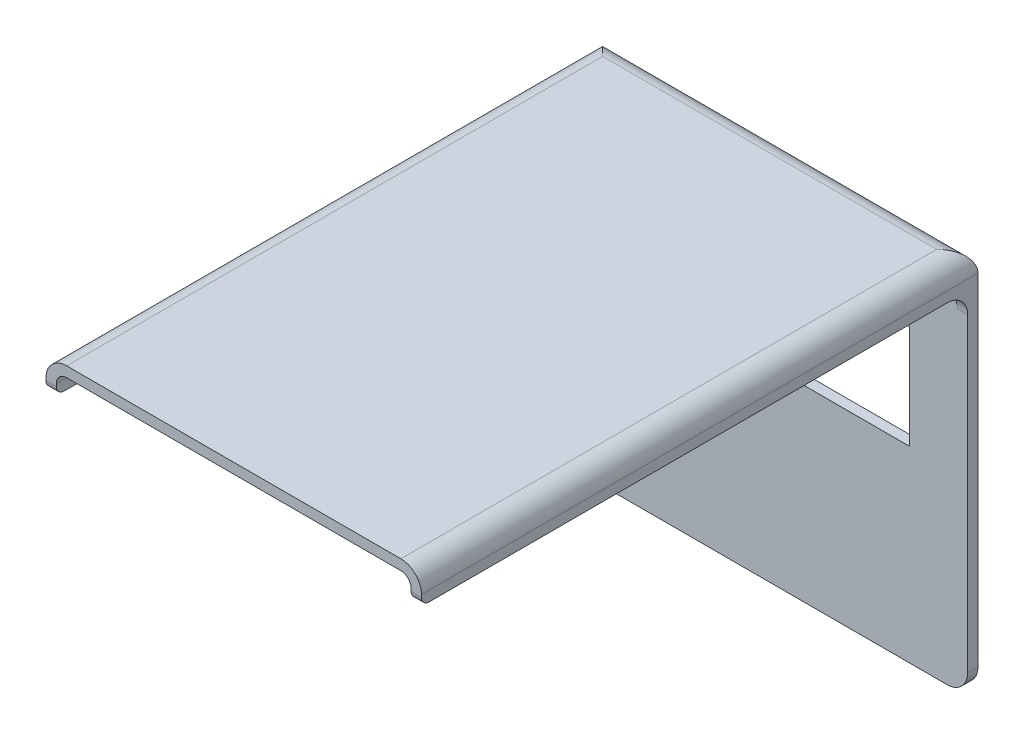
ISO-10303-21;
HEADER;
FILE_DESCRIPTION(('STEP AP214'),'2;1');
FILE_NAME('part.step','',(''),(''),'','','');
FILE_SCHEMA(('AUTOMOTIVE_DESIGN { 1 0 10303 214 1 1 1 1 }'));
ENDSEC;
DATA;
#1=APPLICATION_CONTEXT('core data for automotive mechanical design processes');
#2=APPLICATION_PROTOCOL_DEFINITION('international standard','automotive_design',2000,#1);
#3=PRODUCT_CONTEXT('',#1,'mechanical');
#4=PRODUCT('Part','Part','',(#3));
#5=PRODUCT_RELATED_PRODUCT_CATEGORY('part','',(#4));
#6=PRODUCT_DEFINITION_FORMATION('','',#4);
#7=PRODUCT_DEFINITION_CONTEXT('part definition',#1,'design');
#8=PRODUCT_DEFINITION('design','',#6,#7);
#9=PRODUCT_DEFINITION_SHAPE('','',#8);
#10=(LENGTH_UNIT() NAMED_UNIT(*) SI_UNIT(.MILLI.,.METRE.));
#11=(NAMED_UNIT(*) PLANE_ANGLE_UNIT() SI_UNIT($,.RADIAN.));
#12=(NAMED_UNIT(*) SI_UNIT($,.STERADIAN.) SOLID_ANGLE_UNIT());
#13=UNCERTAINTY_MEASURE_WITH_UNIT(LENGTH_MEASURE(1.E-05),#10,'distance_accuracy_value','');
#14=(GEOMETRIC_REPRESENTATION_CONTEXT(3) GLOBAL_UNCERTAINTY_ASSIGNED_CONTEXT((#13)) GLOBAL_UNIT_ASSIGNED_CONTEXT((#10,
#11,#12)) REPRESENTATION_CONTEXT('',''));
#15=CARTESIAN_POINT('',(0.,0.,0.));
#16=DIRECTION('',(0.,0.,1.));
#17=DIRECTION('',(1.,0.,0.));
#18=AXIS2_PLACEMENT_3D('',#15,#16,#17);
#19=CARTESIAN_POINT('',(-36.425,-4.,-53.5));
#20=DIRECTION('',(0.,-1.,0.));
#21=DIRECTION('',(0.,0.,-1.));
#22=AXIS2_PLACEMENT_3D('',#19,#20,#21);
#23=PLANE('',#22);
#24=DIRECTION('',(0.,0.,1.));
#25=VECTOR('',#24,1.);
#26=CARTESIAN_POINT('',(-34.425,-4.,55.5));
#27=LINE('',#26,#25);
#28=CARTESIAN_POINT('',(-34.425,-4.,-47.5));
#29=VERTEX_POINT('',#28);
#30=CARTESIAN_POINT('',(-34.425,-4.,53.));
#31=VERTEX_POINT('',#30);
#32=EDGE_CURVE('E327',#29,#31,#27,.T.);
#33=ORIENTED_EDGE('',*,*,#32,.T.);
#34=DIRECTION('',(1.,0.,0.));
#35=VECTOR('',#34,1.);
#36=CARTESIAN_POINT('',(-36.425,-4.,53.));
#37=LINE('',#36,#35);
#38=CARTESIAN_POINT('',(-36.425,-4.,53.));
#39=VERTEX_POINT('',#38);
#40=EDGE_CURVE('E304',#31,#39,#37,.F.);
#41=ORIENTED_EDGE('',*,*,#40,.T.);
#42=DIRECTION('',(0.,0.,-1.));
#43=VECTOR('',#42,1.);
#44=CARTESIAN_POINT('',(-36.425,-4.,55.5));
#45=LINE('',#44,#43);
#46=CARTESIAN_POINT('',(-36.425,-4.,-47.5));
#47=VERTEX_POINT('',#46);
#48=EDGE_CURVE('E315',#39,#47,#45,.T.);
#49=ORIENTED_EDGE('',*,*,#48,.T.);
#50=DIRECTION('',(1.,0.,0.));
#51=VECTOR('',#50,1.);
#52=CARTESIAN_POINT('',(-36.425,-4.,-47.5));
#53=LINE('',#52,#51);
#54=EDGE_CURVE('E276',#47,#29,#53,.T.);
#55=ORIENTED_EDGE('',*,*,#54,.T.);
#56=EDGE_LOOP('',(#33,#41,#49,#55));
#57=FACE_BOUND('',#56,.T.);
#58=ADVANCED_FACE('F31',(#57),#23,.T.);
#59=CARTESIAN_POINT('',(36.425,-4.,55.5));
#60=DIRECTION('',(0.,-1.,0.));
#61=DIRECTION('',(0.,0.,-1.));
#62=AXIS2_PLACEMENT_3D('',#59,#60,#61);
#63=PLANE('',#62);
#64=DIRECTION('',(0.,0.,1.));
#65=VECTOR('',#64,1.);
#66=CARTESIAN_POINT('',(36.425,-4.,-53.5));
#67=LINE('',#66,#65);
#68=CARTESIAN_POINT('',(36.425,-4.,-47.5));
#69=VERTEX_POINT('',#68);
#70=CARTESIAN_POINT('',(36.425,-4.,53.));
#71=VERTEX_POINT('',#70);
#72=EDGE_CURVE('E334',#69,#71,#67,.T.);
#73=ORIENTED_EDGE('',*,*,#72,.T.);
#74=DIRECTION('',(1.,0.,0.));
#75=VECTOR('',#74,1.);
#76=CARTESIAN_POINT('',(36.425,-4.,53.));
#77=LINE('',#76,#75);
#78=CARTESIAN_POINT('',(34.425,-4.,53.));
#79=VERTEX_POINT('',#78);
#80=EDGE_CURVE('E39',#71,#79,#77,.F.);
#81=ORIENTED_EDGE('',*,*,#80,.T.);
#82=DIRECTION('',(0.,0.,-1.));
#83=VECTOR('',#82,1.);
#84=CARTESIAN_POINT('',(34.425,-4.,-53.5));
#85=LINE('',#84,#83);
#86=CARTESIAN_POINT('',(34.425,-4.,-47.5));
#87=VERTEX_POINT('',#86);
#88=EDGE_CURVE('E343',#79,#87,#85,.T.);
#89=ORIENTED_EDGE('',*,*,#88,.T.);
#90=DIRECTION('',(-1.,0.,0.));
#91=VECTOR('',#90,1.);
#92=CARTESIAN_POINT('',(36.425,-4.,-47.5));
#93=LINE('',#92,#91);
#94=EDGE_CURVE('E284',#87,#69,#93,.F.);
#95=ORIENTED_EDGE('',*,*,#94,.T.);
#96=EDGE_LOOP('',(#73,#81,#89,#95));
#97=FACE_BOUND('',#96,.T.);
#98=ADVANCED_FACE('F397',(#97),#63,.T.);
#99=CARTESIAN_POINT('',(34.425,-4.,-53.5));
#100=DIRECTION('',(1.,0.,0.));
#101=DIRECTION('',(0.,0.,-1.));
#102=AXIS2_PLACEMENT_3D('',#99,#100,#101);
#103=PLANE('',#102);
#104=ORIENTED_EDGE('',*,*,#88,.F.);
#105=CARTESIAN_POINT('',(34.425,-2.5,53.));
#106=DIRECTION('',(1.,0.,0.));
#107=DIRECTION('',(0.,0.,-1.));
#108=AXIS2_PLACEMENT_3D('',#105,#106,#107);
#109=CIRCLE('',#108,1.5);
#110=CARTESIAN_POINT('',(34.425,-2.5,54.5));
#111=VERTEX_POINT('',#110);
#112=EDGE_CURVE('E11',#79,#111,#109,.F.);
#113=ORIENTED_EDGE('',*,*,#112,.T.);
#114=DIRECTION('',(0.,-1.,0.));
#115=VECTOR('',#114,1.);
#116=CARTESIAN_POINT('',(34.425,-2.,54.5));
#117=LINE('',#116,#115);
#118=CARTESIAN_POINT('',(34.425,-2.,54.5));
#119=VERTEX_POINT('',#118);
#120=EDGE_CURVE('E385',#119,#111,#117,.T.);
#121=ORIENTED_EDGE('',*,*,#120,.F.);
#122=DIRECTION('',(0.,0.,-1.));
#123=VECTOR('',#122,1.);
#124=CARTESIAN_POINT('',(34.425,-2.,-53.5));
#125=LINE('',#124,#123);
#126=CARTESIAN_POINT('',(34.425,-2.,-51.5));
#127=VERTEX_POINT('',#126);
#128=EDGE_CURVE('E355',#119,#127,#125,.T.);
#129=ORIENTED_EDGE('',*,*,#128,.T.);
#130=DIRECTION('',(0.,-1.,0.));
#131=VECTOR('',#130,1.);
#132=CARTESIAN_POINT('',(34.425,-67.,-51.5));
#133=LINE('',#132,#131);
#134=CARTESIAN_POINT('',(34.425,-8.,-51.5));
#135=VERTEX_POINT('',#134);
#136=EDGE_CURVE('E345',#127,#135,#133,.T.);
#137=ORIENTED_EDGE('',*,*,#136,.T.);
#138=CARTESIAN_POINT('',(34.425,-8.,-47.5));
#139=DIRECTION('',(1.,0.,0.));
#140=DIRECTION('',(0.,0.,-1.));
#141=AXIS2_PLACEMENT_3D('',#138,#139,#140);
#142=CIRCLE('',#141,4.);
#143=EDGE_CURVE('E292',#135,#87,#142,.T.);
#144=ORIENTED_EDGE('',*,*,#143,.T.);
#145=EDGE_LOOP('',(#104,#113,#121,#129,#137,#144));
#146=FACE_BOUND('',#145,.T.);
#147=ADVANCED_FACE('F394',(#146),#103,.F.);
#148=CARTESIAN_POINT('',(-34.425,-4.,55.5));
#149=DIRECTION('',(-1.,0.,0.));
#150=DIRECTION('',(0.,0.,1.));
#151=AXIS2_PLACEMENT_3D('',#148,#149,#150);
#152=PLANE('',#151);
#153=DIRECTION('',(0.,1.,0.));
#154=VECTOR('',#153,1.);
#155=CARTESIAN_POINT('',(-34.425,-4.,54.5));
#156=LINE('',#155,#154);
#157=CARTESIAN_POINT('',(-34.425,-2.5,54.5));
#158=VERTEX_POINT('',#157);
#159=CARTESIAN_POINT('',(-34.425,-2.,54.5));
#160=VERTEX_POINT('',#159);
#161=EDGE_CURVE('E320',#158,#160,#156,.T.);
#162=ORIENTED_EDGE('',*,*,#161,.F.);
#163=CARTESIAN_POINT('',(-34.425,-2.5,53.));
#164=DIRECTION('',(-1.,0.,0.));
#165=DIRECTION('',(0.,0.,1.));
#166=AXIS2_PLACEMENT_3D('',#163,#164,#165);
#167=CIRCLE('',#166,1.5);
#168=EDGE_CURVE('E302',#158,#31,#167,.F.);
#169=ORIENTED_EDGE('',*,*,#168,.T.);
#170=ORIENTED_EDGE('',*,*,#32,.F.);
#171=CARTESIAN_POINT('',(-34.425,-8.,-47.5));
#172=DIRECTION('',(-1.,0.,0.));
#173=DIRECTION('',(0.,0.,1.));
#174=AXIS2_PLACEMENT_3D('',#171,#172,#173);
#175=CIRCLE('',#174,4.);
#176=CARTESIAN_POINT('',(-34.425,-8.,-51.5));
#177=VERTEX_POINT('',#176);
#178=EDGE_CURVE('E286',#29,#177,#175,.T.);
#179=ORIENTED_EDGE('',*,*,#178,.T.);
#180=DIRECTION('',(0.,1.,0.));
#181=VECTOR('',#180,1.);
#182=CARTESIAN_POINT('',(-34.425,-67.,-51.5));
#183=LINE('',#182,#181);
#184=CARTESIAN_POINT('',(-34.425,-2.,-51.5));
#185=VERTEX_POINT('',#184);
#186=EDGE_CURVE('E331',#177,#185,#183,.T.);
#187=ORIENTED_EDGE('',*,*,#186,.T.);
#188=DIRECTION('',(0.,0.,1.));
#189=VECTOR('',#188,1.);
#190=CARTESIAN_POINT('',(-34.425,-2.,55.5));
#191=LINE('',#190,#189);
#192=EDGE_CURVE('E364',#185,#160,#191,.T.);
#193=ORIENTED_EDGE('',*,*,#192,.T.);
#194=EDGE_LOOP('',(#162,#169,#170,#179,#187,#193));
#195=FACE_BOUND('',#194,.T.);
#196=ADVANCED_FACE('F326',(#195),#152,.F.);
#197=CARTESIAN_POINT('',(34.425,2.,-53.5));
#198=DIRECTION('',(0.,-1.,0.));
#199=DIRECTION('',(0.,0.,-1.));
#200=AXIS2_PLACEMENT_3D('',#197,#198,#199);
#201=PLANE('',#200);
#202=DIRECTION('',(-1.,0.,0.));
#203=VECTOR('',#202,1.);
#204=CARTESIAN_POINT('',(32.425,2.,54.5));
#205=LINE('',#204,#203);
#206=CARTESIAN_POINT('',(32.425,2.,54.5));
#207=VERTEX_POINT('',#206);
#208=CARTESIAN_POINT('',(-32.425,2.,54.5));
#209=VERTEX_POINT('',#208);
#210=EDGE_CURVE('E218',#207,#209,#205,.T.);
#211=ORIENTED_EDGE('',*,*,#210,.F.);
#212=DIRECTION('',(0.,0.,-1.));
#213=VECTOR('',#212,1.);
#214=CARTESIAN_POINT('',(32.425,2.,-49.5));
#215=LINE('',#214,#213);
#216=CARTESIAN_POINT('',(32.425,2.,-49.5));
#217=VERTEX_POINT('',#216);
#218=EDGE_CURVE('E232',#207,#217,#215,.T.);
#219=ORIENTED_EDGE('',*,*,#218,.T.);
#220=DIRECTION('',(-1.,0.,0.));
#221=VECTOR('',#220,1.);
#222=CARTESIAN_POINT('',(34.425,2.,-49.5));
#223=LINE('',#222,#221);
#224=CARTESIAN_POINT('',(-32.425,2.,-49.5));
#225=VERTEX_POINT('',#224);
#226=EDGE_CURVE('E247',#217,#225,#223,.T.);
#227=ORIENTED_EDGE('',*,*,#226,.T.);
#228=DIRECTION('',(0.,0.,1.));
#229=VECTOR('',#228,1.);
#230=CARTESIAN_POINT('',(-32.425,2.,55.5));
#231=LINE('',#230,#229);
#232=EDGE_CURVE('E235',#225,#209,#231,.T.);
#233=ORIENTED_EDGE('',*,*,#232,.T.);
#234=EDGE_LOOP('',(#211,#219,#227,#233));
#235=FACE_BOUND('',#234,.T.);
#236=ADVANCED_FACE('F230',(#235),#201,.F.);
#237=CARTESIAN_POINT('',(34.425,0.,-53.5));
#238=DIRECTION('',(0.,-1.,0.));
#239=DIRECTION('',(0.,0.,-1.));
#240=AXIS2_PLACEMENT_3D('',#237,#238,#239);
#241=PLANE('',#240);
#242=DIRECTION('',(0.,0.,-1.));
#243=VECTOR('',#242,1.);
#244=CARTESIAN_POINT('',(32.425,0.,-53.5));
#245=LINE('',#244,#243);
#246=CARTESIAN_POINT('',(32.425,0.,-49.5));
#247=VERTEX_POINT('',#246);
#248=CARTESIAN_POINT('',(32.425,0.,54.5));
#249=VERTEX_POINT('',#248);
#250=EDGE_CURVE('E361',#247,#249,#245,.F.);
#251=ORIENTED_EDGE('',*,*,#250,.T.);
#252=DIRECTION('',(1.,0.,0.));
#253=VECTOR('',#252,1.);
#254=CARTESIAN_POINT('',(-32.425,0.,54.5));
#255=LINE('',#254,#253);
#256=CARTESIAN_POINT('',(-32.425,0.,54.5));
#257=VERTEX_POINT('',#256);
#258=EDGE_CURVE('E381',#257,#249,#255,.T.);
#259=ORIENTED_EDGE('',*,*,#258,.F.);
#260=DIRECTION('',(0.,0.,1.));
#261=VECTOR('',#260,1.);
#262=CARTESIAN_POINT('',(-32.425,0.,-53.5));
#263=LINE('',#262,#261);
#264=CARTESIAN_POINT('',(-32.425,0.,-49.5));
#265=VERTEX_POINT('',#264);
#266=EDGE_CURVE('E359',#257,#265,#263,.F.);
#267=ORIENTED_EDGE('',*,*,#266,.T.);
#268=DIRECTION('',(-1.,0.,0.));
#269=VECTOR('',#268,1.);
#270=CARTESIAN_POINT('',(34.425,0.,-49.5));
#271=LINE('',#270,#269);
#272=EDGE_CURVE('E357',#265,#247,#271,.F.);
#273=ORIENTED_EDGE('',*,*,#272,.T.);
#274=EDGE_LOOP('',(#251,#259,#267,#273));
#275=FACE_BOUND('',#274,.T.);
#276=ADVANCED_FACE('F554',(#275),#241,.T.);
#277=CARTESIAN_POINT('',(-36.425,0.5,-50.5));
#278=DIRECTION('',(-1.,0.,0.));
#279=DIRECTION('',(0.,0.,1.));
#280=AXIS2_PLACEMENT_3D('',#277,#278,#279);
#281=PLANE('',#280);
#282=ORIENTED_EDGE('',*,*,#48,.F.);
#283=CARTESIAN_POINT('',(-36.425,-2.5,53.));
#284=DIRECTION('',(-1.,0.,0.));
#285=DIRECTION('',(0.,0.,1.));
#286=AXIS2_PLACEMENT_3D('',#283,#284,#285);
#287=CIRCLE('',#286,1.5);
#288=CARTESIAN_POINT('',(-36.425,-2.5,54.5));
#289=VERTEX_POINT('',#288);
#290=EDGE_CURVE('E306',#39,#289,#287,.T.);
#291=ORIENTED_EDGE('',*,*,#290,.T.);
#292=DIRECTION('',(0.,-1.,0.));
#293=VECTOR('',#292,1.);
#294=CARTESIAN_POINT('',(-36.425,-2.,54.5));
#295=LINE('',#294,#293);
#296=CARTESIAN_POINT('',(-36.425,-2.,54.5));
#297=VERTEX_POINT('',#296);
#298=EDGE_CURVE('E313',#297,#289,#295,.T.);
#299=ORIENTED_EDGE('',*,*,#298,.F.);
#300=DIRECTION('',(0.,0.,1.));
#301=VECTOR('',#300,1.);
#302=CARTESIAN_POINT('',(-36.425,-2.,-49.5));
#303=LINE('',#302,#301);
#304=CARTESIAN_POINT('',(-36.425,-2.,-53.5));
#305=VERTEX_POINT('',#304);
#306=EDGE_CURVE('E244',#297,#305,#303,.F.);
#307=ORIENTED_EDGE('',*,*,#306,.T.);
#308=DIRECTION('',(0.,-1.,0.));
#309=VECTOR('',#308,1.);
#310=CARTESIAN_POINT('',(-36.425,0.5,-53.5));
#311=LINE('',#310,#309);
#312=CARTESIAN_POINT('',(-36.425,-68.16,-53.5));
#313=VERTEX_POINT('',#312);
#314=EDGE_CURVE('E434',#305,#313,#311,.T.);
#315=ORIENTED_EDGE('',*,*,#314,.T.);
#316=DIRECTION('',(0.,0.,1.));
#317=VECTOR('',#316,1.);
#318=CARTESIAN_POINT('',(-36.425,-68.16,-50.5));
#319=LINE('',#318,#317);
#320=CARTESIAN_POINT('',(-36.425,-68.16,-51.5));
#321=VERTEX_POINT('',#320);
#322=EDGE_CURVE('E257',#313,#321,#319,.T.);
#323=ORIENTED_EDGE('',*,*,#322,.T.);
#324=DIRECTION('',(0.,1.,0.));
#325=VECTOR('',#324,1.);
#326=CARTESIAN_POINT('',(-36.425,-72.16,-51.5));
#327=LINE('',#326,#325);
#328=CARTESIAN_POINT('',(-36.425,-8.00000000000001,-51.5));
#329=VERTEX_POINT('',#328);
#330=EDGE_CURVE('E412',#321,#329,#327,.T.);
#331=ORIENTED_EDGE('',*,*,#330,.T.);
#332=CARTESIAN_POINT('',(-36.425,-8.,-47.5));
#333=DIRECTION('',(-1.,0.,0.));
#334=DIRECTION('',(0.,0.,1.));
#335=AXIS2_PLACEMENT_3D('',#332,#333,#334);
#336=CIRCLE('',#335,4.);
#337=EDGE_CURVE('E289',#329,#47,#336,.F.);
#338=ORIENTED_EDGE('',*,*,#337,.T.);
#339=EDGE_LOOP('',(#282,#291,#299,#307,#315,#323,#331,#338));
#340=FACE_BOUND('',#339,.T.);
#341=ADVANCED_FACE('F312',(#340),#281,.T.);
#342=CARTESIAN_POINT('',(36.425,0.5,55.5));
#343=DIRECTION('',(1.,0.,0.));
#344=DIRECTION('',(0.,0.,-1.));
#345=AXIS2_PLACEMENT_3D('',#342,#343,#344);
#346=PLANE('',#345);
#347=DIRECTION('',(0.,1.,0.));
#348=VECTOR('',#347,1.);
#349=CARTESIAN_POINT('',(36.425,-4.,54.5));
#350=LINE('',#349,#348);
#351=CARTESIAN_POINT('',(36.425,-2.5,54.5));
#352=VERTEX_POINT('',#351);
#353=CARTESIAN_POINT('',(36.425,-2.,54.5));
#354=VERTEX_POINT('',#353);
#355=EDGE_CURVE('E221',#352,#354,#350,.T.);
#356=ORIENTED_EDGE('',*,*,#355,.F.);
#357=CARTESIAN_POINT('',(36.425,-2.5,53.));
#358=DIRECTION('',(1.,0.,0.));
#359=DIRECTION('',(0.,0.,-1.));
#360=AXIS2_PLACEMENT_3D('',#357,#358,#359);
#361=CIRCLE('',#360,1.5);
#362=EDGE_CURVE('E53',#352,#71,#361,.T.);
#363=ORIENTED_EDGE('',*,*,#362,.T.);
#364=ORIENTED_EDGE('',*,*,#72,.F.);
#365=CARTESIAN_POINT('',(36.425,-8.,-47.5));
#366=DIRECTION('',(1.,0.,0.));
#367=DIRECTION('',(0.,0.,-1.));
#368=AXIS2_PLACEMENT_3D('',#365,#366,#367);
#369=CIRCLE('',#368,4.);
#370=CARTESIAN_POINT('',(36.425,-8.,-51.5));
#371=VERTEX_POINT('',#370);
#372=EDGE_CURVE('E295',#69,#371,#369,.F.);
#373=ORIENTED_EDGE('',*,*,#372,.T.);
#374=DIRECTION('',(0.,-1.,0.));
#375=VECTOR('',#374,1.);
#376=CARTESIAN_POINT('',(36.425,-4.,-51.5));
#377=LINE('',#376,#375);
#378=CARTESIAN_POINT('',(36.425,-68.16,-51.5));
#379=VERTEX_POINT('',#378);
#380=EDGE_CURVE('E407',#371,#379,#377,.T.);
#381=ORIENTED_EDGE('',*,*,#380,.T.);
#382=DIRECTION('',(0.,0.,-1.));
#383=VECTOR('',#382,1.);
#384=CARTESIAN_POINT('',(36.425,-68.16,55.5));
#385=LINE('',#384,#383);
#386=CARTESIAN_POINT('',(36.425,-68.16,-53.5));
#387=VERTEX_POINT('',#386);
#388=EDGE_CURVE('E273',#379,#387,#385,.T.);
#389=ORIENTED_EDGE('',*,*,#388,.T.);
#390=DIRECTION('',(0.,1.,0.));
#391=VECTOR('',#390,1.);
#392=CARTESIAN_POINT('',(36.425,2.,-53.5));
#393=LINE('',#392,#391);
#394=CARTESIAN_POINT('',(36.425,-2.,-53.5));
#395=VERTEX_POINT('',#394);
#396=EDGE_CURVE('E348',#387,#395,#393,.T.);
#397=ORIENTED_EDGE('',*,*,#396,.T.);
#398=DIRECTION('',(0.,0.,-1.));
#399=VECTOR('',#398,1.);
#400=CARTESIAN_POINT('',(36.425,-2.,55.5));
#401=LINE('',#400,#399);
#402=EDGE_CURVE('E255',#395,#354,#401,.F.);
#403=ORIENTED_EDGE('',*,*,#402,.T.);
#404=EDGE_LOOP('',(#356,#363,#364,#373,#381,#389,#397,#403));
#405=FACE_BOUND('',#404,.T.);
#406=ADVANCED_FACE('F400',(#405),#346,.T.);
#407=CARTESIAN_POINT('',(-32.425,-2.,55.5));
#408=DIRECTION('',(0.,0.,1.));
#409=DIRECTION('',(1.,0.,0.));
#410=AXIS2_PLACEMENT_3D('',#407,#408,#409);
#411=CYLINDRICAL_SURFACE('',#410,2.);
#412=CARTESIAN_POINT('',(-32.425,-2.,54.5));
#413=DIRECTION('',(0.,0.,-1.));
#414=DIRECTION('',(1.,0.,0.));
#415=AXIS2_PLACEMENT_3D('',#412,#413,#414);
#416=CIRCLE('',#415,2.);
#417=EDGE_CURVE('E379',#160,#257,#416,.T.);
#418=ORIENTED_EDGE('',*,*,#417,.F.);
#419=ORIENTED_EDGE('',*,*,#192,.F.);
#420=CARTESIAN_POINT('',(-32.425,-2.,-49.5));
#421=DIRECTION('',(-0.707106781186547,0.,0.707106781186547));
#422=DIRECTION('',(0.707106781186547,0.,0.707106781186547));
#423=AXIS2_PLACEMENT_3D('',#420,#421,#422);
#424=ELLIPSE('',#423,2.82842712474619,2.);
#425=EDGE_CURVE('E336',#265,#185,#424,.T.);
#426=ORIENTED_EDGE('',*,*,#425,.F.);
#427=ORIENTED_EDGE('',*,*,#266,.F.);
#428=EDGE_LOOP('',(#418,#419,#426,#427));
#429=FACE_BOUND('',#428,.T.);
#430=ADVANCED_FACE('F557',(#429),#411,.F.);
#431=CARTESIAN_POINT('',(32.425,-2.,-53.5));
#432=DIRECTION('',(0.,0.,-1.));
#433=DIRECTION('',(-1.,0.,0.));
#434=AXIS2_PLACEMENT_3D('',#431,#432,#433);
#435=CYLINDRICAL_SURFACE('',#434,2.);
#436=CARTESIAN_POINT('',(32.425,-2.,54.5));
#437=DIRECTION('',(0.,0.,-1.));
#438=DIRECTION('',(1.,0.,0.));
#439=AXIS2_PLACEMENT_3D('',#436,#437,#438);
#440=CIRCLE('',#439,2.);
#441=EDGE_CURVE('E383',#249,#119,#440,.T.);
#442=ORIENTED_EDGE('',*,*,#441,.F.);
#443=ORIENTED_EDGE('',*,*,#250,.F.);
#444=CARTESIAN_POINT('',(32.425,-2.,-49.5));
#445=DIRECTION('',(-0.707106781186547,0.,-0.707106781186547));
#446=DIRECTION('',(0.707106781186547,0.,-0.707106781186547));
#447=AXIS2_PLACEMENT_3D('',#444,#445,#446);
#448=ELLIPSE('',#447,2.82842712474619,2.);
#449=EDGE_CURVE('E368',#247,#127,#448,.T.);
#450=ORIENTED_EDGE('',*,*,#449,.T.);
#451=ORIENTED_EDGE('',*,*,#128,.F.);
#452=EDGE_LOOP('',(#442,#443,#450,#451));
#453=FACE_BOUND('',#452,.T.);
#454=ADVANCED_FACE('F642',(#453),#435,.F.);
#455=CARTESIAN_POINT('',(-32.425,-2.,-53.5));
#456=DIRECTION('',(0.,0.,-1.));
#457=DIRECTION('',(-1.,0.,0.));
#458=AXIS2_PLACEMENT_3D('',#455,#456,#457);
#459=CYLINDRICAL_SURFACE('',#458,4.);
#460=ORIENTED_EDGE('',*,*,#306,.F.);
#461=CARTESIAN_POINT('',(-32.425,-2.,54.5));
#462=DIRECTION('',(0.,0.,1.));
#463=DIRECTION('',(1.,0.,0.));
#464=AXIS2_PLACEMENT_3D('',#461,#462,#463);
#465=CIRCLE('',#464,4.);
#466=EDGE_CURVE('E236',#209,#297,#465,.T.);
#467=ORIENTED_EDGE('',*,*,#466,.F.);
#468=ORIENTED_EDGE('',*,*,#232,.F.);
#469=CARTESIAN_POINT('',(-32.425,-2.,-49.5));
#470=DIRECTION('',(-0.707106781186547,0.,0.707106781186547));
#471=DIRECTION('',(-0.707106781186547,0.,-0.707106781186547));
#472=AXIS2_PLACEMENT_3D('',#469,#470,#471);
#473=ELLIPSE('',#472,5.65685424949238,4.);
#474=EDGE_CURVE('E253',#305,#225,#473,.F.);
#475=ORIENTED_EDGE('',*,*,#474,.F.);
#476=EDGE_LOOP('',(#460,#467,#468,#475));
#477=FACE_BOUND('',#476,.T.);
#478=ADVANCED_FACE('F375',(#477),#459,.T.);
#479=CARTESIAN_POINT('',(32.425,-2.,-53.5));
#480=DIRECTION('',(0.,0.,1.));
#481=DIRECTION('',(1.,0.,0.));
#482=AXIS2_PLACEMENT_3D('',#479,#480,#481);
#483=CYLINDRICAL_SURFACE('',#482,4.);
#484=ORIENTED_EDGE('',*,*,#218,.F.);
#485=CARTESIAN_POINT('',(32.425,-2.,54.5));
#486=DIRECTION('',(0.,0.,1.));
#487=DIRECTION('',(1.,0.,0.));
#488=AXIS2_PLACEMENT_3D('',#485,#486,#487);
#489=CIRCLE('',#488,4.);
#490=EDGE_CURVE('E214',#354,#207,#489,.T.);
#491=ORIENTED_EDGE('',*,*,#490,.F.);
#492=ORIENTED_EDGE('',*,*,#402,.F.);
#493=CARTESIAN_POINT('',(32.425,-2.,-49.5));
#494=DIRECTION('',(-0.707106781186547,0.,-0.707106781186547));
#495=DIRECTION('',(-0.707106781186547,0.,0.707106781186547));
#496=AXIS2_PLACEMENT_3D('',#493,#494,#495);
#497=ELLIPSE('',#496,5.65685424949238,4.);
#498=EDGE_CURVE('E240',#217,#395,#497,.T.);
#499=ORIENTED_EDGE('',*,*,#498,.F.);
#500=EDGE_LOOP('',(#484,#491,#492,#499));
#501=FACE_BOUND('',#500,.T.);
#502=ADVANCED_FACE('F238',(#501),#483,.T.);
#503=CARTESIAN_POINT('',(-34.425,-67.,-51.5));
#504=DIRECTION('',(0.,0.,-1.));
#505=DIRECTION('',(-1.,0.,0.));
#506=AXIS2_PLACEMENT_3D('',#503,#504,#505);
#507=PLANE('',#506);
#508=DIRECTION('',(0.,-1.,0.));
#509=VECTOR('',#508,1.);
#510=CARTESIAN_POINT('',(6.85,-15.65,-51.5));
#511=LINE('',#510,#509);
#512=CARTESIAN_POINT('',(6.85,-15.65,-51.5));
#513=VERTEX_POINT('',#512);
#514=CARTESIAN_POINT('',(6.85,-20.95,-51.5));
#515=VERTEX_POINT('',#514);
#516=EDGE_CURVE('E452',#513,#515,#511,.T.);
#517=ORIENTED_EDGE('',*,*,#516,.F.);
#518=DIRECTION('',(-1.,0.,0.));
#519=VECTOR('',#518,1.);
#520=CARTESIAN_POINT('',(25.15,-15.65,-51.5));
#521=LINE('',#520,#519);
#522=CARTESIAN_POINT('',(25.15,-15.65,-51.5));
#523=VERTEX_POINT('',#522);
#524=EDGE_CURVE('E455',#523,#513,#521,.T.);
#525=ORIENTED_EDGE('',*,*,#524,.F.);
#526=DIRECTION('',(0.,1.,0.));
#527=VECTOR('',#526,1.);
#528=CARTESIAN_POINT('',(25.15,-15.65,-51.5));
#529=LINE('',#528,#527);
#530=CARTESIAN_POINT('',(25.15,-35.75,-51.5));
#531=VERTEX_POINT('',#530);
#532=EDGE_CURVE('E353',#531,#523,#529,.T.);
#533=ORIENTED_EDGE('',*,*,#532,.F.);
#534=DIRECTION('',(1.,0.,0.));
#535=VECTOR('',#534,1.);
#536=CARTESIAN_POINT('',(25.15,-35.75,-51.5));
#537=LINE('',#536,#535);
#538=CARTESIAN_POINT('',(-25.15,-35.75,-51.5));
#539=VERTEX_POINT('',#538);
#540=EDGE_CURVE('E437',#539,#531,#537,.T.);
#541=ORIENTED_EDGE('',*,*,#540,.F.);
#542=DIRECTION('',(0.,-1.,0.));
#543=VECTOR('',#542,1.);
#544=CARTESIAN_POINT('',(-25.15,-15.65,-51.5));
#545=LINE('',#544,#543);
#546=CARTESIAN_POINT('',(-25.15,-15.65,-51.5));
#547=VERTEX_POINT('',#546);
#548=EDGE_CURVE('E438',#547,#539,#545,.T.);
#549=ORIENTED_EDGE('',*,*,#548,.F.);
#550=DIRECTION('',(-1.,0.,0.));
#551=VECTOR('',#550,1.);
#552=CARTESIAN_POINT('',(-6.85,-15.65,-51.5));
#553=LINE('',#552,#551);
#554=CARTESIAN_POINT('',(-6.85,-15.65,-51.5));
#555=VERTEX_POINT('',#554);
#556=EDGE_CURVE('E443',#555,#547,#553,.T.);
#557=ORIENTED_EDGE('',*,*,#556,.F.);
#558=DIRECTION('',(0.,1.,0.));
#559=VECTOR('',#558,1.);
#560=CARTESIAN_POINT('',(-6.85,-15.65,-51.5));
#561=LINE('',#560,#559);
#562=CARTESIAN_POINT('',(-6.85,-20.95,-51.5));
#563=VERTEX_POINT('',#562);
#564=EDGE_CURVE('E446',#563,#555,#561,.T.);
#565=ORIENTED_EDGE('',*,*,#564,.F.);
#566=DIRECTION('',(-1.,0.,0.));
#567=VECTOR('',#566,1.);
#568=CARTESIAN_POINT('',(5.325,-20.95,-51.5));
#569=LINE('',#568,#567);
#570=EDGE_CURVE('E449',#515,#563,#569,.T.);
#571=ORIENTED_EDGE('',*,*,#570,.F.);
#572=EDGE_LOOP('',(#517,#525,#533,#541,#549,#557,#565,#571));
#573=FACE_BOUND('',#572,.T.);
#574=ORIENTED_EDGE('',*,*,#186,.F.);
#575=DIRECTION('',(1.,0.,0.));
#576=VECTOR('',#575,1.);
#577=CARTESIAN_POINT('',(-34.425,-8.,-51.5));
#578=LINE('',#577,#576);
#579=EDGE_CURVE('E282',#177,#329,#578,.F.);
#580=ORIENTED_EDGE('',*,*,#579,.T.);
#581=ORIENTED_EDGE('',*,*,#330,.F.);
#582=CARTESIAN_POINT('',(-32.425,-68.16,-51.5));
#583=DIRECTION('',(0.,0.,-1.));
#584=DIRECTION('',(-1.,0.,0.));
#585=AXIS2_PLACEMENT_3D('',#582,#583,#584);
#586=CIRCLE('',#585,4.);
#587=CARTESIAN_POINT('',(-32.425,-72.16,-51.5));
#588=VERTEX_POINT('',#587);
#589=EDGE_CURVE('E263',#321,#588,#586,.F.);
#590=ORIENTED_EDGE('',*,*,#589,.T.);
#591=DIRECTION('',(-1.,0.,0.));
#592=VECTOR('',#591,1.);
#593=CARTESIAN_POINT('',(34.425,-72.16,-51.5));
#594=LINE('',#593,#592);
#595=CARTESIAN_POINT('',(32.425,-72.16,-51.5));
#596=VERTEX_POINT('',#595);
#597=EDGE_CURVE('E226',#596,#588,#594,.T.);
#598=ORIENTED_EDGE('',*,*,#597,.F.);
#599=CARTESIAN_POINT('',(32.425,-68.16,-51.5));
#600=DIRECTION('',(0.,0.,-1.));
#601=DIRECTION('',(-1.,0.,0.));
#602=AXIS2_PLACEMENT_3D('',#599,#600,#601);
#603=CIRCLE('',#602,4.);
#604=EDGE_CURVE('E260',#596,#379,#603,.F.);
#605=ORIENTED_EDGE('',*,*,#604,.T.);
#606=ORIENTED_EDGE('',*,*,#380,.F.);
#607=DIRECTION('',(-1.,0.,0.));
#608=VECTOR('',#607,1.);
#609=CARTESIAN_POINT('',(-34.425,-8.,-51.5));
#610=LINE('',#609,#608);
#611=EDGE_CURVE('E279',#371,#135,#610,.T.);
#612=ORIENTED_EDGE('',*,*,#611,.T.);
#613=ORIENTED_EDGE('',*,*,#136,.F.);
#614=DIRECTION('',(-1.,0.,0.));
#615=VECTOR('',#614,1.);
#616=CARTESIAN_POINT('',(-34.425,-2.,-51.5));
#617=LINE('',#616,#615);
#618=EDGE_CURVE('E366',#127,#185,#617,.T.);
#619=ORIENTED_EDGE('',*,*,#618,.T.);
#620=EDGE_LOOP('',(#574,#580,#581,#590,#598,#605,#606,#612,#613,#619));
#621=FACE_BOUND('',#620,.T.);
#622=ADVANCED_FACE('F406',(#573,#621),#507,.F.);
#623=CARTESIAN_POINT('',(-34.425,2.,-53.5));
#624=DIRECTION('',(0.,0.,1.));
#625=DIRECTION('',(1.,0.,0.));
#626=AXIS2_PLACEMENT_3D('',#623,#624,#625);
#627=PLANE('',#626);
#628=DIRECTION('',(1.,0.,0.));
#629=VECTOR('',#628,1.);
#630=CARTESIAN_POINT('',(-34.425,-72.16,-53.5));
#631=LINE('',#630,#629);
#632=CARTESIAN_POINT('',(-32.425,-72.16,-53.5));
#633=VERTEX_POINT('',#632);
#634=CARTESIAN_POINT('',(32.425,-72.16,-53.5));
#635=VERTEX_POINT('',#634);
#636=EDGE_CURVE('E411',#633,#635,#631,.T.);
#637=ORIENTED_EDGE('',*,*,#636,.F.);
#638=CARTESIAN_POINT('',(-32.425,-68.16,-53.5));
#639=DIRECTION('',(0.,0.,1.));
#640=DIRECTION('',(1.,0.,0.));
#641=AXIS2_PLACEMENT_3D('',#638,#639,#640);
#642=CIRCLE('',#641,4.);
#643=EDGE_CURVE('E271',#633,#313,#642,.F.);
#644=ORIENTED_EDGE('',*,*,#643,.T.);
#645=ORIENTED_EDGE('',*,*,#314,.F.);
#646=DIRECTION('',(-1.,0.,0.));
#647=VECTOR('',#646,1.);
#648=CARTESIAN_POINT('',(-34.425,-2.,-53.5));
#649=LINE('',#648,#647);
#650=EDGE_CURVE('E242',#305,#395,#649,.F.);
#651=ORIENTED_EDGE('',*,*,#650,.T.);
#652=ORIENTED_EDGE('',*,*,#396,.F.);
#653=CARTESIAN_POINT('',(32.425,-68.16,-53.5));
#654=DIRECTION('',(0.,0.,1.));
#655=DIRECTION('',(1.,0.,0.));
#656=AXIS2_PLACEMENT_3D('',#653,#654,#655);
#657=CIRCLE('',#656,4.);
#658=EDGE_CURVE('E269',#387,#635,#657,.F.);
#659=ORIENTED_EDGE('',*,*,#658,.T.);
#660=EDGE_LOOP('',(#637,#644,#645,#651,#652,#659));
#661=FACE_BOUND('',#660,.T.);
#662=DIRECTION('',(0.,-1.,0.));
#663=VECTOR('',#662,1.);
#664=CARTESIAN_POINT('',(25.15,-15.65,-53.5));
#665=LINE('',#664,#663);
#666=CARTESIAN_POINT('',(25.15,-15.65,-53.5));
#667=VERTEX_POINT('',#666);
#668=CARTESIAN_POINT('',(25.15,-35.75,-53.5));
#669=VERTEX_POINT('',#668);
#670=EDGE_CURVE('E460',#667,#669,#665,.T.);
#671=ORIENTED_EDGE('',*,*,#670,.F.);
#672=DIRECTION('',(1.,0.,0.));
#673=VECTOR('',#672,1.);
#674=CARTESIAN_POINT('',(25.15,-15.65,-53.5));
#675=LINE('',#674,#673);
#676=CARTESIAN_POINT('',(6.85,-15.65,-53.5));
#677=VERTEX_POINT('',#676);
#678=EDGE_CURVE('E458',#677,#667,#675,.T.);
#679=ORIENTED_EDGE('',*,*,#678,.F.);
#680=DIRECTION('',(0.,1.,0.));
#681=VECTOR('',#680,1.);
#682=CARTESIAN_POINT('',(6.85,-15.65,-53.5));
#683=LINE('',#682,#681);
#684=CARTESIAN_POINT('',(6.85,-20.95,-53.5));
#685=VERTEX_POINT('',#684);
#686=EDGE_CURVE('E478',#685,#677,#683,.T.);
#687=ORIENTED_EDGE('',*,*,#686,.F.);
#688=DIRECTION('',(1.,0.,0.));
#689=VECTOR('',#688,1.);
#690=CARTESIAN_POINT('',(5.325,-20.95,-53.5));
#691=LINE('',#690,#689);
#692=CARTESIAN_POINT('',(-6.85,-20.95,-53.5));
#693=VERTEX_POINT('',#692);
#694=EDGE_CURVE('E475',#693,#685,#691,.T.);
#695=ORIENTED_EDGE('',*,*,#694,.F.);
#696=DIRECTION('',(0.,-1.,0.));
#697=VECTOR('',#696,1.);
#698=CARTESIAN_POINT('',(-6.85,-15.65,-53.5));
#699=LINE('',#698,#697);
#700=CARTESIAN_POINT('',(-6.85,-15.65,-53.5));
#701=VERTEX_POINT('',#700);
#702=EDGE_CURVE('E472',#701,#693,#699,.T.);
#703=ORIENTED_EDGE('',*,*,#702,.F.);
#704=DIRECTION('',(1.,0.,0.));
#705=VECTOR('',#704,1.);
#706=CARTESIAN_POINT('',(-6.85,-15.65,-53.5));
#707=LINE('',#706,#705);
#708=CARTESIAN_POINT('',(-25.15,-15.65,-53.5));
#709=VERTEX_POINT('',#708);
#710=EDGE_CURVE('E469',#709,#701,#707,.T.);
#711=ORIENTED_EDGE('',*,*,#710,.F.);
#712=DIRECTION('',(0.,1.,0.));
#713=VECTOR('',#712,1.);
#714=CARTESIAN_POINT('',(-25.15,-15.65,-53.5));
#715=LINE('',#714,#713);
#716=CARTESIAN_POINT('',(-25.15,-35.75,-53.5));
#717=VERTEX_POINT('',#716);
#718=EDGE_CURVE('E466',#717,#709,#715,.T.);
#719=ORIENTED_EDGE('',*,*,#718,.F.);
#720=DIRECTION('',(-1.,0.,0.));
#721=VECTOR('',#720,1.);
#722=CARTESIAN_POINT('',(25.15,-35.75,-53.5));
#723=LINE('',#722,#721);
#724=EDGE_CURVE('E463',#669,#717,#723,.T.);
#725=ORIENTED_EDGE('',*,*,#724,.F.);
#726=EDGE_LOOP('',(#671,#679,#687,#695,#703,#711,#719,#725));
#727=FACE_BOUND('',#726,.T.);
#728=ADVANCED_FACE('F432',(#661,#727),#627,.F.);
#729=CARTESIAN_POINT('',(25.15,-15.65,53.501025));
#730=DIRECTION('',(0.,1.,0.));
#731=DIRECTION('',(0.,0.,1.));
#732=AXIS2_PLACEMENT_3D('',#729,#730,#731);
#733=PLANE('',#732);
#734=ORIENTED_EDGE('',*,*,#524,.T.);
#735=DIRECTION('',(0.,0.,-1.));
#736=VECTOR('',#735,1.);
#737=CARTESIAN_POINT('',(6.85,-15.65,53.501025));
#738=LINE('',#737,#736);
#739=EDGE_CURVE('E482',#513,#677,#738,.T.);
#740=ORIENTED_EDGE('',*,*,#739,.T.);
#741=ORIENTED_EDGE('',*,*,#678,.T.);
#742=DIRECTION('',(0.,0.,-1.));
#743=VECTOR('',#742,1.);
#744=CARTESIAN_POINT('',(25.15,-15.65,53.501025));
#745=LINE('',#744,#743);
#746=EDGE_CURVE('E481',#523,#667,#745,.T.);
#747=ORIENTED_EDGE('',*,*,#746,.F.);
#748=EDGE_LOOP('',(#734,#740,#741,#747));
#749=FACE_BOUND('',#748,.T.);
#750=ADVANCED_FACE('F516',(#749),#733,.F.);
#751=CARTESIAN_POINT('',(6.85,-15.65,53.501025));
#752=DIRECTION('',(-1.,0.,0.));
#753=DIRECTION('',(0.,0.,1.));
#754=AXIS2_PLACEMENT_3D('',#751,#752,#753);
#755=PLANE('',#754);
#756=ORIENTED_EDGE('',*,*,#516,.T.);
#757=DIRECTION('',(0.,0.,-1.));
#758=VECTOR('',#757,1.);
#759=CARTESIAN_POINT('',(6.85,-20.95,53.501025));
#760=LINE('',#759,#758);
#761=EDGE_CURVE('E484',#515,#685,#760,.T.);
#762=ORIENTED_EDGE('',*,*,#761,.T.);
#763=ORIENTED_EDGE('',*,*,#686,.T.);
#764=ORIENTED_EDGE('',*,*,#739,.F.);
#765=EDGE_LOOP('',(#756,#762,#763,#764));
#766=FACE_BOUND('',#765,.T.);
#767=ADVANCED_FACE('F518',(#766),#755,.F.);
#768=CARTESIAN_POINT('',(5.325,-20.95,53.501025));
#769=DIRECTION('',(0.,1.,0.));
#770=DIRECTION('',(0.,0.,1.));
#771=AXIS2_PLACEMENT_3D('',#768,#769,#770);
#772=PLANE('',#771);
#773=ORIENTED_EDGE('',*,*,#570,.T.);
#774=DIRECTION('',(0.,0.,-1.));
#775=VECTOR('',#774,1.);
#776=CARTESIAN_POINT('',(-6.85,-20.95,53.501025));
#777=LINE('',#776,#775);
#778=EDGE_CURVE('E486',#563,#693,#777,.T.);
#779=ORIENTED_EDGE('',*,*,#778,.T.);
#780=ORIENTED_EDGE('',*,*,#694,.T.);
#781=ORIENTED_EDGE('',*,*,#761,.F.);
#782=EDGE_LOOP('',(#773,#779,#780,#781));
#783=FACE_BOUND('',#782,.T.);
#784=ADVANCED_FACE('F522',(#783),#772,.F.);
#785=CARTESIAN_POINT('',(-6.85,-15.65,53.501025));
#786=DIRECTION('',(1.,0.,0.));
#787=DIRECTION('',(0.,0.,-1.));
#788=AXIS2_PLACEMENT_3D('',#785,#786,#787);
#789=PLANE('',#788);
#790=ORIENTED_EDGE('',*,*,#564,.T.);
#791=DIRECTION('',(0.,0.,-1.));
#792=VECTOR('',#791,1.);
#793=CARTESIAN_POINT('',(-6.85,-15.65,53.501025));
#794=LINE('',#793,#792);
#795=EDGE_CURVE('E488',#555,#701,#794,.T.);
#796=ORIENTED_EDGE('',*,*,#795,.T.);
#797=ORIENTED_EDGE('',*,*,#702,.T.);
#798=ORIENTED_EDGE('',*,*,#778,.F.);
#799=EDGE_LOOP('',(#790,#796,#797,#798));
#800=FACE_BOUND('',#799,.T.);
#801=ADVANCED_FACE('F525',(#800),#789,.F.);
#802=CARTESIAN_POINT('',(-6.85,-15.65,53.501025));
#803=DIRECTION('',(0.,1.,0.));
#804=DIRECTION('',(0.,0.,1.));
#805=AXIS2_PLACEMENT_3D('',#802,#803,#804);
#806=PLANE('',#805);
#807=ORIENTED_EDGE('',*,*,#556,.T.);
#808=DIRECTION('',(0.,0.,-1.));
#809=VECTOR('',#808,1.);
#810=CARTESIAN_POINT('',(-25.15,-15.65,53.501025));
#811=LINE('',#810,#809);
#812=EDGE_CURVE('E490',#547,#709,#811,.T.);
#813=ORIENTED_EDGE('',*,*,#812,.T.);
#814=ORIENTED_EDGE('',*,*,#710,.T.);
#815=ORIENTED_EDGE('',*,*,#795,.F.);
#816=EDGE_LOOP('',(#807,#813,#814,#815));
#817=FACE_BOUND('',#816,.T.);
#818=ADVANCED_FACE('F528',(#817),#806,.F.);
#819=CARTESIAN_POINT('',(-25.15,-15.65,53.501025));
#820=DIRECTION('',(-1.,0.,0.));
#821=DIRECTION('',(0.,0.,1.));
#822=AXIS2_PLACEMENT_3D('',#819,#820,#821);
#823=PLANE('',#822);
#824=ORIENTED_EDGE('',*,*,#548,.T.);
#825=DIRECTION('',(0.,0.,-1.));
#826=VECTOR('',#825,1.);
#827=CARTESIAN_POINT('',(-25.15,-35.75,53.501025));
#828=LINE('',#827,#826);
#829=EDGE_CURVE('E492',#539,#717,#828,.T.);
#830=ORIENTED_EDGE('',*,*,#829,.T.);
#831=ORIENTED_EDGE('',*,*,#718,.T.);
#832=ORIENTED_EDGE('',*,*,#812,.F.);
#833=EDGE_LOOP('',(#824,#830,#831,#832));
#834=FACE_BOUND('',#833,.T.);
#835=ADVANCED_FACE('F530',(#834),#823,.F.);
#836=CARTESIAN_POINT('',(25.15,-35.75,53.501025));
#837=DIRECTION('',(0.,-1.,0.));
#838=DIRECTION('',(0.,0.,-1.));
#839=AXIS2_PLACEMENT_3D('',#836,#837,#838);
#840=PLANE('',#839);
#841=ORIENTED_EDGE('',*,*,#540,.T.);
#842=DIRECTION('',(0.,0.,-1.));
#843=VECTOR('',#842,1.);
#844=CARTESIAN_POINT('',(25.15,-35.75,53.501025));
#845=LINE('',#844,#843);
#846=EDGE_CURVE('E494',#531,#669,#845,.T.);
#847=ORIENTED_EDGE('',*,*,#846,.T.);
#848=ORIENTED_EDGE('',*,*,#724,.T.);
#849=ORIENTED_EDGE('',*,*,#829,.F.);
#850=EDGE_LOOP('',(#841,#847,#848,#849));
#851=FACE_BOUND('',#850,.T.);
#852=ADVANCED_FACE('F510',(#851),#840,.F.);
#853=CARTESIAN_POINT('',(25.15,-15.65,53.501025));
#854=DIRECTION('',(1.,0.,0.));
#855=DIRECTION('',(0.,0.,-1.));
#856=AXIS2_PLACEMENT_3D('',#853,#854,#855);
#857=PLANE('',#856);
#858=ORIENTED_EDGE('',*,*,#532,.T.);
#859=ORIENTED_EDGE('',*,*,#746,.T.);
#860=ORIENTED_EDGE('',*,*,#670,.T.);
#861=ORIENTED_EDGE('',*,*,#846,.F.);
#862=EDGE_LOOP('',(#858,#859,#860,#861));
#863=FACE_BOUND('',#862,.T.);
#864=ADVANCED_FACE('F499',(#863),#857,.F.);
#865=CARTESIAN_POINT('',(-34.425,-2.,-49.5));
#866=DIRECTION('',(-1.,0.,0.));
#867=DIRECTION('',(0.,0.,1.));
#868=AXIS2_PLACEMENT_3D('',#865,#866,#867);
#869=CYLINDRICAL_SURFACE('',#868,2.);
#870=ORIENTED_EDGE('',*,*,#425,.T.);
#871=ORIENTED_EDGE('',*,*,#618,.F.);
#872=ORIENTED_EDGE('',*,*,#449,.F.);
#873=ORIENTED_EDGE('',*,*,#272,.F.);
#874=EDGE_LOOP('',(#870,#871,#872,#873));
#875=FACE_BOUND('',#874,.T.);
#876=ADVANCED_FACE('F590',(#875),#869,.F.);
#877=CARTESIAN_POINT('',(34.425,-2.,-49.5));
#878=DIRECTION('',(-1.,0.,0.));
#879=DIRECTION('',(0.,0.,1.));
#880=AXIS2_PLACEMENT_3D('',#877,#878,#879);
#881=CYLINDRICAL_SURFACE('',#880,4.);
#882=ORIENTED_EDGE('',*,*,#650,.F.);
#883=ORIENTED_EDGE('',*,*,#474,.T.);
#884=ORIENTED_EDGE('',*,*,#226,.F.);
#885=ORIENTED_EDGE('',*,*,#498,.T.);
#886=EDGE_LOOP('',(#882,#883,#884,#885));
#887=FACE_BOUND('',#886,.T.);
#888=ADVANCED_FACE('F600',(#887),#881,.T.);
#889=CARTESIAN_POINT('',(32.425,-2.,54.5));
#890=DIRECTION('',(0.,0.,1.));
#891=DIRECTION('',(1.,0.,0.));
#892=AXIS2_PLACEMENT_3D('',#889,#890,#891);
#893=PLANE('',#892);
#894=ORIENTED_EDGE('',*,*,#298,.T.);
#895=DIRECTION('',(1.,0.,0.));
#896=VECTOR('',#895,1.);
#897=CARTESIAN_POINT('',(32.425,-2.5,54.5));
#898=LINE('',#897,#896);
#899=EDGE_CURVE('E299',#289,#158,#898,.T.);
#900=ORIENTED_EDGE('',*,*,#899,.T.);
#901=ORIENTED_EDGE('',*,*,#161,.T.);
#902=ORIENTED_EDGE('',*,*,#417,.T.);
#903=ORIENTED_EDGE('',*,*,#258,.T.);
#904=ORIENTED_EDGE('',*,*,#441,.T.);
#905=ORIENTED_EDGE('',*,*,#120,.T.);
#906=DIRECTION('',(1.,0.,0.));
#907=VECTOR('',#906,1.);
#908=CARTESIAN_POINT('',(32.425,-2.5,54.5));
#909=LINE('',#908,#907);
#910=EDGE_CURVE('E297',#111,#352,#909,.T.);
#911=ORIENTED_EDGE('',*,*,#910,.T.);
#912=ORIENTED_EDGE('',*,*,#355,.T.);
#913=ORIENTED_EDGE('',*,*,#490,.T.);
#914=ORIENTED_EDGE('',*,*,#210,.T.);
#915=ORIENTED_EDGE('',*,*,#466,.T.);
#916=EDGE_LOOP('',(#894,#900,#901,#902,#903,#904,#905,#911,#912,#913,#914,#915));
#917=FACE_BOUND('',#916,.T.);
#918=ADVANCED_FACE('F217',(#917),#893,.T.);
#919=CARTESIAN_POINT('',(-34.425,-72.16,-53.5));
#920=DIRECTION('',(0.,-1.,0.));
#921=DIRECTION('',(0.,0.,-1.));
#922=AXIS2_PLACEMENT_3D('',#919,#920,#921);
#923=PLANE('',#922);
#924=ORIENTED_EDGE('',*,*,#597,.T.);
#925=DIRECTION('',(0.,0.,1.));
#926=VECTOR('',#925,1.);
#927=CARTESIAN_POINT('',(-32.425,-72.16,-53.5));
#928=LINE('',#927,#926);
#929=EDGE_CURVE('E267',#588,#633,#928,.F.);
#930=ORIENTED_EDGE('',*,*,#929,.T.);
#931=ORIENTED_EDGE('',*,*,#636,.T.);
#932=DIRECTION('',(0.,0.,-1.));
#933=VECTOR('',#932,1.);
#934=CARTESIAN_POINT('',(32.425,-72.16,-53.5));
#935=LINE('',#934,#933);
#936=EDGE_CURVE('E265',#635,#596,#935,.F.);
#937=ORIENTED_EDGE('',*,*,#936,.T.);
#938=EDGE_LOOP('',(#924,#930,#931,#937));
#939=FACE_BOUND('',#938,.T.);
#940=ADVANCED_FACE('F422',(#939),#923,.T.);
#941=CARTESIAN_POINT('',(-32.425,-68.16,-50.5));
#942=DIRECTION('',(0.,0.,1.));
#943=DIRECTION('',(1.,0.,0.));
#944=AXIS2_PLACEMENT_3D('',#941,#942,#943);
#945=CYLINDRICAL_SURFACE('',#944,4.);
#946=ORIENTED_EDGE('',*,*,#643,.F.);
#947=ORIENTED_EDGE('',*,*,#929,.F.);
#948=ORIENTED_EDGE('',*,*,#589,.F.);
#949=ORIENTED_EDGE('',*,*,#322,.F.);
#950=EDGE_LOOP('',(#946,#947,#948,#949));
#951=FACE_BOUND('',#950,.T.);
#952=ADVANCED_FACE('F427',(#951),#945,.T.);
#953=CARTESIAN_POINT('',(32.425,-68.16,55.5));
#954=DIRECTION('',(0.,0.,-1.));
#955=DIRECTION('',(-1.,0.,0.));
#956=AXIS2_PLACEMENT_3D('',#953,#954,#955);
#957=CYLINDRICAL_SURFACE('',#956,4.);
#958=ORIENTED_EDGE('',*,*,#604,.F.);
#959=ORIENTED_EDGE('',*,*,#936,.F.);
#960=ORIENTED_EDGE('',*,*,#658,.F.);
#961=ORIENTED_EDGE('',*,*,#388,.F.);
#962=EDGE_LOOP('',(#958,#959,#960,#961));
#963=FACE_BOUND('',#962,.T.);
#964=ADVANCED_FACE('F697',(#963),#957,.T.);
#965=CARTESIAN_POINT('',(-36.425,-8.,-47.5));
#966=DIRECTION('',(1.,0.,0.));
#967=DIRECTION('',(0.,0.,-1.));
#968=AXIS2_PLACEMENT_3D('',#965,#966,#967);
#969=CYLINDRICAL_SURFACE('',#968,4.);
#970=ORIENTED_EDGE('',*,*,#337,.F.);
#971=ORIENTED_EDGE('',*,*,#579,.F.);
#972=ORIENTED_EDGE('',*,*,#178,.F.);
#973=ORIENTED_EDGE('',*,*,#54,.F.);
#974=EDGE_LOOP('',(#970,#971,#972,#973));
#975=FACE_BOUND('',#974,.T.);
#976=ADVANCED_FACE('F706',(#975),#969,.F.);
#977=CARTESIAN_POINT('',(-34.425,-8.,-47.5));
#978=DIRECTION('',(-1.,0.,0.));
#979=DIRECTION('',(0.,0.,1.));
#980=AXIS2_PLACEMENT_3D('',#977,#978,#979);
#981=CYLINDRICAL_SURFACE('',#980,4.);
#982=ORIENTED_EDGE('',*,*,#372,.F.);
#983=ORIENTED_EDGE('',*,*,#94,.F.);
#984=ORIENTED_EDGE('',*,*,#143,.F.);
#985=ORIENTED_EDGE('',*,*,#611,.F.);
#986=EDGE_LOOP('',(#982,#983,#984,#985));
#987=FACE_BOUND('',#986,.T.);
#988=ADVANCED_FACE('F403',(#987),#981,.F.);
#989=CARTESIAN_POINT('',(32.425,-2.5,53.));
#990=DIRECTION('',(1.,0.,0.));
#991=DIRECTION('',(0.,0.,-1.));
#992=AXIS2_PLACEMENT_3D('',#989,#990,#991);
#993=CYLINDRICAL_SURFACE('',#992,1.5);
#994=ORIENTED_EDGE('',*,*,#290,.F.);
#995=ORIENTED_EDGE('',*,*,#40,.F.);
#996=ORIENTED_EDGE('',*,*,#168,.F.);
#997=ORIENTED_EDGE('',*,*,#899,.F.);
#998=EDGE_LOOP('',(#994,#995,#996,#997));
#999=FACE_BOUND('',#998,.T.);
#1000=ADVANCED_FACE('F322',(#999),#993,.T.);
#1001=CARTESIAN_POINT('',(32.425,-2.5,53.));
#1002=DIRECTION('',(1.,0.,0.));
#1003=DIRECTION('',(0.,0.,-1.));
#1004=AXIS2_PLACEMENT_3D('',#1001,#1002,#1003);
#1005=CYLINDRICAL_SURFACE('',#1004,1.5);
#1006=ORIENTED_EDGE('',*,*,#112,.F.);
#1007=ORIENTED_EDGE('',*,*,#80,.F.);
#1008=ORIENTED_EDGE('',*,*,#362,.F.);
#1009=ORIENTED_EDGE('',*,*,#910,.F.);
#1010=EDGE_LOOP('',(#1006,#1007,#1008,#1009));
#1011=FACE_BOUND('',#1010,.T.);
#1012=ADVANCED_FACE('F33',(#1011),#1005,.T.);
#1013=CLOSED_SHELL('',(#58,#98,#147,#196,#236,#276,#341,#406,#430,#454,#478,#502,#622,#728,#750,
#767,#784,#801,#818,#835,#852,#864,#876,#888,#918,#940,#952,#964,#976,#988,#1000,#1012));
#1014=MANIFOLD_SOLID_BREP('B2',#1013);
#1015=ADVANCED_BREP_SHAPE_REPRESENTATION('',(#18,#1014),#14);
#1016=SHAPE_DEFINITION_REPRESENTATION(#9,#1015);
ENDSEC;
END-ISO-10303-21;
